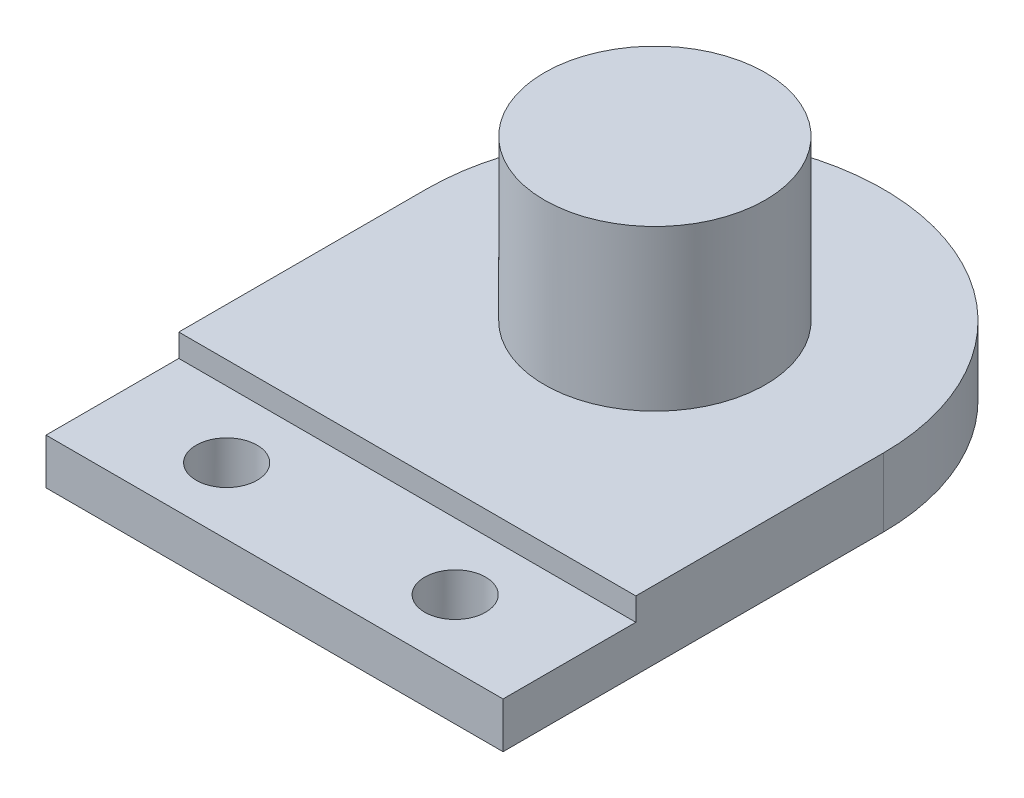
ISO-10303-21;
HEADER;
FILE_DESCRIPTION(('STEP AP214'),'2;1');
FILE_NAME('part.step','',(''),(''),'','','');
FILE_SCHEMA(('AUTOMOTIVE_DESIGN { 1 0 10303 214 1 1 1 1 }'));
ENDSEC;
DATA;
#1=APPLICATION_CONTEXT('core data for automotive mechanical design processes');
#2=APPLICATION_PROTOCOL_DEFINITION('international standard','automotive_design',2000,#1);
#3=PRODUCT_CONTEXT('',#1,'mechanical');
#4=PRODUCT('Part','Part','',(#3));
#5=PRODUCT_RELATED_PRODUCT_CATEGORY('part','',(#4));
#6=PRODUCT_DEFINITION_FORMATION('','',#4);
#7=PRODUCT_DEFINITION_CONTEXT('part definition',#1,'design');
#8=PRODUCT_DEFINITION('design','',#6,#7);
#9=PRODUCT_DEFINITION_SHAPE('','',#8);
#10=(LENGTH_UNIT() NAMED_UNIT(*) SI_UNIT(.MILLI.,.METRE.));
#11=(NAMED_UNIT(*) PLANE_ANGLE_UNIT() SI_UNIT($,.RADIAN.));
#12=(NAMED_UNIT(*) SI_UNIT($,.STERADIAN.) SOLID_ANGLE_UNIT());
#13=UNCERTAINTY_MEASURE_WITH_UNIT(LENGTH_MEASURE(1.E-05),#10,'distance_accuracy_value','');
#14=(GEOMETRIC_REPRESENTATION_CONTEXT(3) GLOBAL_UNCERTAINTY_ASSIGNED_CONTEXT((#13)) GLOBAL_UNIT_ASSIGNED_CONTEXT((#10,
#11,#12)) REPRESENTATION_CONTEXT('',''));
#15=CARTESIAN_POINT('',(0.,0.,0.));
#16=DIRECTION('',(0.,0.,1.));
#17=DIRECTION('',(1.,0.,0.));
#18=AXIS2_PLACEMENT_3D('',#15,#16,#17);
#19=CARTESIAN_POINT('',(0.,1.8,0.));
#20=DIRECTION('',(0.,0.,-1.));
#21=DIRECTION('',(-1.,0.,0.));
#22=AXIS2_PLACEMENT_3D('',#19,#20,#21);
#23=PLANE('',#22);
#24=DIRECTION('',(0.,-1.,0.));
#25=VECTOR('',#24,1.);
#26=CARTESIAN_POINT('',(12.,1.8,0.));
#27=LINE('',#26,#25);
#28=CARTESIAN_POINT('',(12.,1.2,0.));
#29=VERTEX_POINT('',#28);
#30=CARTESIAN_POINT('',(12.,0.,0.));
#31=VERTEX_POINT('',#30);
#32=EDGE_CURVE('E47',#29,#31,#27,.T.);
#33=ORIENTED_EDGE('',*,*,#32,.F.);
#34=DIRECTION('',(1.,0.,0.));
#35=VECTOR('',#34,1.);
#36=CARTESIAN_POINT('',(12.,1.2,0.));
#37=LINE('',#36,#35);
#38=CARTESIAN_POINT('',(0.,1.2,0.));
#39=VERTEX_POINT('',#38);
#40=EDGE_CURVE('E89',#39,#29,#37,.T.);
#41=ORIENTED_EDGE('',*,*,#40,.F.);
#42=DIRECTION('',(0.,-1.,0.));
#43=VECTOR('',#42,1.);
#44=CARTESIAN_POINT('',(0.,1.8,0.));
#45=LINE('',#44,#43);
#46=CARTESIAN_POINT('',(0.,0.,0.));
#47=VERTEX_POINT('',#46);
#48=EDGE_CURVE('E83',#39,#47,#45,.T.);
#49=ORIENTED_EDGE('',*,*,#48,.T.);
#50=DIRECTION('',(1.,0.,0.));
#51=VECTOR('',#50,1.);
#52=CARTESIAN_POINT('',(0.,0.,0.));
#53=LINE('',#52,#51);
#54=EDGE_CURVE('E87',#47,#31,#53,.T.);
#55=ORIENTED_EDGE('',*,*,#54,.T.);
#56=EDGE_LOOP('',(#33,#41,#49,#55));
#57=FACE_BOUND('',#56,.T.);
#58=ADVANCED_FACE('F39',(#57),#23,.F.);
#59=CARTESIAN_POINT('',(12.,1.8,0.));
#60=DIRECTION('',(-1.,0.,0.));
#61=DIRECTION('',(0.,0.,1.));
#62=AXIS2_PLACEMENT_3D('',#59,#60,#61);
#63=PLANE('',#62);
#64=DIRECTION('',(0.,0.,-1.));
#65=VECTOR('',#64,1.);
#66=CARTESIAN_POINT('',(12.,1.8,0.));
#67=LINE('',#66,#65);
#68=CARTESIAN_POINT('',(12.,1.8,-3.48629));
#69=VERTEX_POINT('',#68);
#70=CARTESIAN_POINT('',(12.,1.8,-9.98629));
#71=VERTEX_POINT('',#70);
#72=EDGE_CURVE('E104',#69,#71,#67,.T.);
#73=ORIENTED_EDGE('',*,*,#72,.F.);
#74=DIRECTION('',(0.,1.,0.));
#75=VECTOR('',#74,1.);
#76=CARTESIAN_POINT('',(12.,1.2,-3.48629));
#77=LINE('',#76,#75);
#78=CARTESIAN_POINT('',(12.,1.2,-3.48629));
#79=VERTEX_POINT('',#78);
#80=EDGE_CURVE('E54',#79,#69,#77,.T.);
#81=ORIENTED_EDGE('',*,*,#80,.F.);
#82=DIRECTION('',(0.,0.,-1.));
#83=VECTOR('',#82,1.);
#84=CARTESIAN_POINT('',(12.,1.2,-3.48629));
#85=LINE('',#84,#83);
#86=EDGE_CURVE('E136',#29,#79,#85,.T.);
#87=ORIENTED_EDGE('',*,*,#86,.F.);
#88=ORIENTED_EDGE('',*,*,#32,.T.);
#89=DIRECTION('',(0.,0.,-1.));
#90=VECTOR('',#89,1.);
#91=CARTESIAN_POINT('',(12.,0.,0.));
#92=LINE('',#91,#90);
#93=CARTESIAN_POINT('',(12.,0.,-9.98629));
#94=VERTEX_POINT('',#93);
#95=EDGE_CURVE('E109',#31,#94,#92,.T.);
#96=ORIENTED_EDGE('',*,*,#95,.T.);
#97=DIRECTION('',(0.,-1.,0.));
#98=VECTOR('',#97,1.);
#99=CARTESIAN_POINT('',(12.,1.8,-9.98629));
#100=LINE('',#99,#98);
#101=EDGE_CURVE('E125',#71,#94,#100,.T.);
#102=ORIENTED_EDGE('',*,*,#101,.F.);
#103=EDGE_LOOP('',(#73,#81,#87,#88,#96,#102));
#104=FACE_BOUND('',#103,.T.);
#105=ADVANCED_FACE('F132',(#104),#63,.F.);
#106=CARTESIAN_POINT('',(6.,1.8,-9.98629));
#107=DIRECTION('',(0.,-1.,0.));
#108=DIRECTION('',(0.,0.,-1.));
#109=AXIS2_PLACEMENT_3D('',#106,#107,#108);
#110=CYLINDRICAL_SURFACE('',#109,6.);
#111=CARTESIAN_POINT('',(6.,0.,-9.98629));
#112=DIRECTION('',(0.,1.,0.));
#113=DIRECTION('',(0.,0.,-1.));
#114=AXIS2_PLACEMENT_3D('',#111,#112,#113);
#115=CIRCLE('',#114,6.);
#116=CARTESIAN_POINT('',(0.,0.,-9.98629));
#117=VERTEX_POINT('',#116);
#118=EDGE_CURVE('E105',#94,#117,#115,.T.);
#119=ORIENTED_EDGE('',*,*,#118,.T.);
#120=DIRECTION('',(0.,-1.,0.));
#121=VECTOR('',#120,1.);
#122=CARTESIAN_POINT('',(0.,1.8,-9.98629));
#123=LINE('',#122,#121);
#124=CARTESIAN_POINT('',(0.,1.8,-9.98629));
#125=VERTEX_POINT('',#124);
#126=EDGE_CURVE('E93',#125,#117,#123,.T.);
#127=ORIENTED_EDGE('',*,*,#126,.F.);
#128=CARTESIAN_POINT('',(6.,1.8,-9.98629));
#129=DIRECTION('',(0.,1.,0.));
#130=DIRECTION('',(0.,0.,-1.));
#131=AXIS2_PLACEMENT_3D('',#128,#129,#130);
#132=CIRCLE('',#131,6.);
#133=EDGE_CURVE('E63',#71,#125,#132,.T.);
#134=ORIENTED_EDGE('',*,*,#133,.F.);
#135=ORIENTED_EDGE('',*,*,#101,.T.);
#136=EDGE_LOOP('',(#119,#127,#134,#135));
#137=FACE_BOUND('',#136,.T.);
#138=ADVANCED_FACE('F170',(#137),#110,.T.);
#139=CARTESIAN_POINT('',(0.,1.8,0.));
#140=DIRECTION('',(1.,0.,0.));
#141=DIRECTION('',(0.,0.,-1.));
#142=AXIS2_PLACEMENT_3D('',#139,#140,#141);
#143=PLANE('',#142);
#144=DIRECTION('',(0.,0.,1.));
#145=VECTOR('',#144,1.);
#146=CARTESIAN_POINT('',(0.,1.2,0.));
#147=LINE('',#146,#145);
#148=CARTESIAN_POINT('',(0.,1.2,-3.48629));
#149=VERTEX_POINT('',#148);
#150=EDGE_CURVE('E148',#149,#39,#147,.T.);
#151=ORIENTED_EDGE('',*,*,#150,.F.);
#152=DIRECTION('',(0.,1.,0.));
#153=VECTOR('',#152,1.);
#154=CARTESIAN_POINT('',(0.,1.2,-3.48629));
#155=LINE('',#154,#153);
#156=CARTESIAN_POINT('',(0.,1.8,-3.48629));
#157=VERTEX_POINT('',#156);
#158=EDGE_CURVE('E111',#149,#157,#155,.T.);
#159=ORIENTED_EDGE('',*,*,#158,.T.);
#160=DIRECTION('',(0.,0.,1.));
#161=VECTOR('',#160,1.);
#162=CARTESIAN_POINT('',(0.,1.8,0.));
#163=LINE('',#162,#161);
#164=EDGE_CURVE('E94',#125,#157,#163,.T.);
#165=ORIENTED_EDGE('',*,*,#164,.F.);
#166=ORIENTED_EDGE('',*,*,#126,.T.);
#167=DIRECTION('',(0.,0.,1.));
#168=VECTOR('',#167,1.);
#169=CARTESIAN_POINT('',(0.,0.,0.));
#170=LINE('',#169,#168);
#171=EDGE_CURVE('E98',#117,#47,#170,.T.);
#172=ORIENTED_EDGE('',*,*,#171,.T.);
#173=ORIENTED_EDGE('',*,*,#48,.F.);
#174=EDGE_LOOP('',(#151,#159,#165,#166,#172,#173));
#175=FACE_BOUND('',#174,.T.);
#176=ADVANCED_FACE('F99',(#175),#143,.F.);
#177=CARTESIAN_POINT('',(6.,1.8,-9.98629));
#178=DIRECTION('',(0.,-1.,0.));
#179=DIRECTION('',(0.,0.,-1.));
#180=AXIS2_PLACEMENT_3D('',#177,#178,#179);
#181=PLANE('',#180);
#182=CARTESIAN_POINT('',(6.,1.8,-9.98629));
#183=DIRECTION('',(0.,-1.,0.));
#184=DIRECTION('',(0.,0.,-1.));
#185=AXIS2_PLACEMENT_3D('',#182,#183,#184);
#186=CIRCLE('',#185,2.9);
#187=CARTESIAN_POINT('',(6.,1.8,-12.88629));
#188=VERTEX_POINT('',#187);
#189=EDGE_CURVE('E11',#188,#188,#186,.F.);
#190=ORIENTED_EDGE('',*,*,#189,.F.);
#191=EDGE_LOOP('',(#190));
#192=FACE_BOUND('',#191,.T.);
#193=ORIENTED_EDGE('',*,*,#164,.T.);
#194=DIRECTION('',(-1.,0.,0.));
#195=VECTOR('',#194,1.);
#196=CARTESIAN_POINT('',(0.,1.8,-3.48629));
#197=LINE('',#196,#195);
#198=EDGE_CURVE('E159',#69,#157,#197,.T.);
#199=ORIENTED_EDGE('',*,*,#198,.F.);
#200=ORIENTED_EDGE('',*,*,#72,.T.);
#201=ORIENTED_EDGE('',*,*,#133,.T.);
#202=EDGE_LOOP('',(#193,#199,#200,#201));
#203=FACE_BOUND('',#202,.T.);
#204=ADVANCED_FACE('F166',(#192,#203),#181,.F.);
#205=CARTESIAN_POINT('',(6.,0.,-9.98629));
#206=DIRECTION('',(0.,-1.,0.));
#207=DIRECTION('',(0.,0.,-1.));
#208=AXIS2_PLACEMENT_3D('',#205,#206,#207);
#209=PLANE('',#208);
#210=CARTESIAN_POINT('',(3.,0.,-1.743145));
#211=DIRECTION('',(0.,-1.,0.));
#212=DIRECTION('',(0.,0.,-1.));
#213=AXIS2_PLACEMENT_3D('',#210,#211,#212);
#214=CIRCLE('',#213,0.8);
#215=CARTESIAN_POINT('',(3.,0.,-2.543145));
#216=VERTEX_POINT('',#215);
#217=EDGE_CURVE('E274',#216,#216,#214,.F.);
#218=ORIENTED_EDGE('',*,*,#217,.T.);
#219=EDGE_LOOP('',(#218));
#220=FACE_BOUND('',#219,.T.);
#221=CARTESIAN_POINT('',(9.,0.,-1.743145));
#222=DIRECTION('',(0.,-1.,0.));
#223=DIRECTION('',(0.,0.,-1.));
#224=AXIS2_PLACEMENT_3D('',#221,#222,#223);
#225=CIRCLE('',#224,0.800000000000001);
#226=CARTESIAN_POINT('',(9.,0.,-2.543145));
#227=VERTEX_POINT('',#226);
#228=EDGE_CURVE('E290',#227,#227,#225,.F.);
#229=ORIENTED_EDGE('',*,*,#228,.T.);
#230=EDGE_LOOP('',(#229));
#231=FACE_BOUND('',#230,.T.);
#232=ORIENTED_EDGE('',*,*,#54,.F.);
#233=ORIENTED_EDGE('',*,*,#171,.F.);
#234=ORIENTED_EDGE('',*,*,#118,.F.);
#235=ORIENTED_EDGE('',*,*,#95,.F.);
#236=EDGE_LOOP('',(#232,#233,#234,#235));
#237=FACE_BOUND('',#236,.T.);
#238=ADVANCED_FACE('F108',(#220,#231,#237),#209,.T.);
#239=CARTESIAN_POINT('',(0.,1.2,-3.48629));
#240=DIRECTION('',(0.,0.,-1.));
#241=DIRECTION('',(-1.,0.,0.));
#242=AXIS2_PLACEMENT_3D('',#239,#240,#241);
#243=PLANE('',#242);
#244=ORIENTED_EDGE('',*,*,#198,.T.);
#245=ORIENTED_EDGE('',*,*,#158,.F.);
#246=DIRECTION('',(-1.,0.,0.));
#247=VECTOR('',#246,1.);
#248=CARTESIAN_POINT('',(0.,1.2,-3.48629));
#249=LINE('',#248,#247);
#250=EDGE_CURVE('E150',#79,#149,#249,.T.);
#251=ORIENTED_EDGE('',*,*,#250,.F.);
#252=ORIENTED_EDGE('',*,*,#80,.T.);
#253=EDGE_LOOP('',(#244,#245,#251,#252));
#254=FACE_BOUND('',#253,.T.);
#255=ADVANCED_FACE('F167',(#254),#243,.F.);
#256=CARTESIAN_POINT('',(0.,1.2,0.));
#257=DIRECTION('',(0.,-1.,0.));
#258=DIRECTION('',(0.,0.,-1.));
#259=AXIS2_PLACEMENT_3D('',#256,#257,#258);
#260=PLANE('',#259);
#261=CARTESIAN_POINT('',(3.,1.2,-1.743145));
#262=DIRECTION('',(0.,1.,0.));
#263=DIRECTION('',(0.,0.,1.));
#264=AXIS2_PLACEMENT_3D('',#261,#262,#263);
#265=CIRCLE('',#264,0.8);
#266=CARTESIAN_POINT('',(3.,1.2,-0.943145));
#267=VERTEX_POINT('',#266);
#268=EDGE_CURVE('E277',#267,#267,#265,.T.);
#269=ORIENTED_EDGE('',*,*,#268,.F.);
#270=EDGE_LOOP('',(#269));
#271=FACE_BOUND('',#270,.T.);
#272=CARTESIAN_POINT('',(9.,1.2,-1.743145));
#273=DIRECTION('',(0.,1.,0.));
#274=DIRECTION('',(0.,0.,1.));
#275=AXIS2_PLACEMENT_3D('',#272,#273,#274);
#276=CIRCLE('',#275,0.800000000000001);
#277=CARTESIAN_POINT('',(9.,1.2,-0.943144999999999));
#278=VERTEX_POINT('',#277);
#279=EDGE_CURVE('E284',#278,#278,#276,.T.);
#280=ORIENTED_EDGE('',*,*,#279,.F.);
#281=EDGE_LOOP('',(#280));
#282=FACE_BOUND('',#281,.T.);
#283=ORIENTED_EDGE('',*,*,#40,.T.);
#284=ORIENTED_EDGE('',*,*,#86,.T.);
#285=ORIENTED_EDGE('',*,*,#250,.T.);
#286=ORIENTED_EDGE('',*,*,#150,.T.);
#287=EDGE_LOOP('',(#283,#284,#285,#286));
#288=FACE_BOUND('',#287,.T.);
#289=ADVANCED_FACE('F149',(#271,#282,#288),#260,.F.);
#290=CARTESIAN_POINT('',(6.,6.,-9.98629));
#291=DIRECTION('',(0.,-1.,0.));
#292=DIRECTION('',(0.,0.,-1.));
#293=AXIS2_PLACEMENT_3D('',#290,#291,#292);
#294=CYLINDRICAL_SURFACE('',#293,2.9);
#295=CARTESIAN_POINT('',(6.,6.,-9.98629));
#296=DIRECTION('',(0.,1.,0.));
#297=DIRECTION('',(0.,0.,1.));
#298=AXIS2_PLACEMENT_3D('',#295,#296,#297);
#299=CIRCLE('',#298,2.9);
#300=CARTESIAN_POINT('',(6.,6.,-7.08629));
#301=VERTEX_POINT('',#300);
#302=EDGE_CURVE('E161',#301,#301,#299,.T.);
#303=ORIENTED_EDGE('',*,*,#302,.F.);
#304=EDGE_LOOP('',(#303));
#305=FACE_BOUND('',#304,.T.);
#306=ORIENTED_EDGE('',*,*,#189,.T.);
#307=EDGE_LOOP('',(#306));
#308=FACE_BOUND('',#307,.T.);
#309=ADVANCED_FACE('F218',(#305,#308),#294,.T.);
#310=CARTESIAN_POINT('',(6.,6.,-9.98629));
#311=DIRECTION('',(0.,1.,0.));
#312=DIRECTION('',(0.,0.,1.));
#313=AXIS2_PLACEMENT_3D('',#310,#311,#312);
#314=PLANE('',#313);
#315=ORIENTED_EDGE('',*,*,#302,.T.);
#316=EDGE_LOOP('',(#315));
#317=FACE_BOUND('',#316,.T.);
#318=ADVANCED_FACE('F223',(#317),#314,.T.);
#319=CARTESIAN_POINT('',(9.,-0.000999999999999916,-1.743145));
#320=DIRECTION('',(0.,1.,0.));
#321=DIRECTION('',(0.,0.,1.));
#322=AXIS2_PLACEMENT_3D('',#319,#320,#321);
#323=CYLINDRICAL_SURFACE('',#322,0.800000000000001);
#324=ORIENTED_EDGE('',*,*,#228,.F.);
#325=EDGE_LOOP('',(#324));
#326=FACE_BOUND('',#325,.T.);
#327=ORIENTED_EDGE('',*,*,#279,.T.);
#328=EDGE_LOOP('',(#327));
#329=FACE_BOUND('',#328,.T.);
#330=ADVANCED_FACE('F233',(#326,#329),#323,.F.);
#331=CARTESIAN_POINT('',(3.,-0.000999999999999916,-1.743145));
#332=DIRECTION('',(0.,1.,0.));
#333=DIRECTION('',(0.,0.,1.));
#334=AXIS2_PLACEMENT_3D('',#331,#332,#333);
#335=CYLINDRICAL_SURFACE('',#334,0.8);
#336=ORIENTED_EDGE('',*,*,#217,.F.);
#337=EDGE_LOOP('',(#336));
#338=FACE_BOUND('',#337,.T.);
#339=ORIENTED_EDGE('',*,*,#268,.T.);
#340=EDGE_LOOP('',(#339));
#341=FACE_BOUND('',#340,.T.);
#342=ADVANCED_FACE('F257',(#338,#341),#335,.F.);
#343=CLOSED_SHELL('',(#58,#105,#138,#176,#204,#238,#255,#289,#309,#318,#330,#342));
#344=MANIFOLD_SOLID_BREP('B2',#343);
#345=ADVANCED_BREP_SHAPE_REPRESENTATION('',(#18,#344),#14);
#346=SHAPE_DEFINITION_REPRESENTATION(#9,#345);
ENDSEC;
END-ISO-10303-21;
